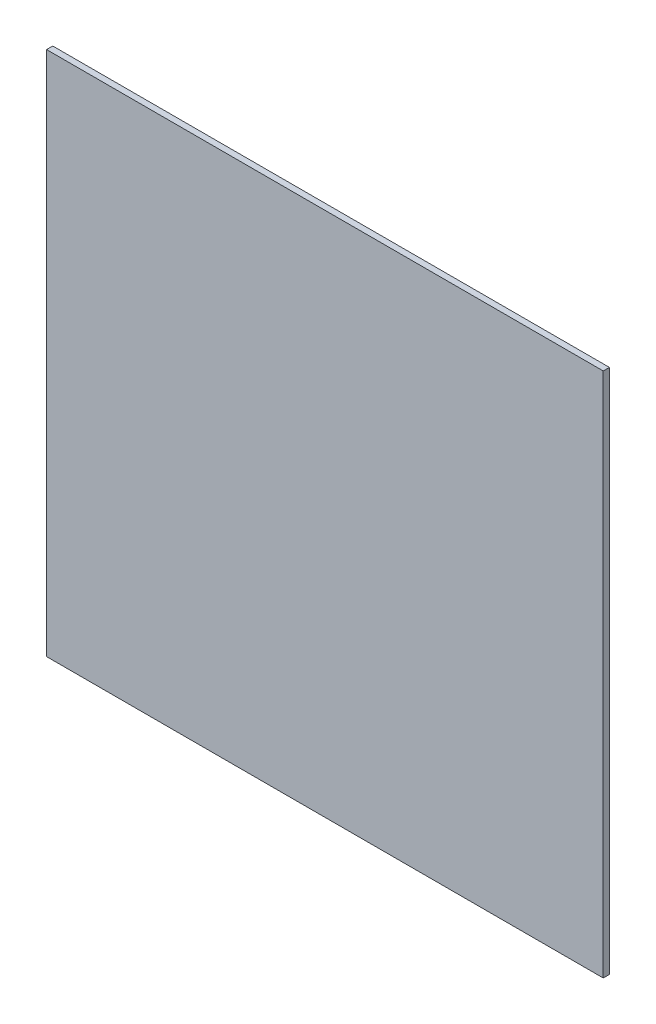
ISO-10303-21;
HEADER;
FILE_DESCRIPTION(('STEP AP214'),'2;1');
FILE_NAME('part.step','',(''),(''),'','','');
FILE_SCHEMA(('AUTOMOTIVE_DESIGN { 1 0 10303 214 1 1 1 1 }'));
ENDSEC;
DATA;
#1=APPLICATION_CONTEXT('core data for automotive mechanical design processes');
#2=APPLICATION_PROTOCOL_DEFINITION('international standard','automotive_design',2000,#1);
#3=PRODUCT_CONTEXT('',#1,'mechanical');
#4=PRODUCT('Part','Part','',(#3));
#5=PRODUCT_RELATED_PRODUCT_CATEGORY('part','',(#4));
#6=PRODUCT_DEFINITION_FORMATION('','',#4);
#7=PRODUCT_DEFINITION_CONTEXT('part definition',#1,'design');
#8=PRODUCT_DEFINITION('design','',#6,#7);
#9=PRODUCT_DEFINITION_SHAPE('','',#8);
#10=(LENGTH_UNIT() NAMED_UNIT(*) SI_UNIT(.MILLI.,.METRE.));
#11=(NAMED_UNIT(*) PLANE_ANGLE_UNIT() SI_UNIT($,.RADIAN.));
#12=(NAMED_UNIT(*) SI_UNIT($,.STERADIAN.) SOLID_ANGLE_UNIT());
#13=UNCERTAINTY_MEASURE_WITH_UNIT(LENGTH_MEASURE(1.E-05),#10,'distance_accuracy_value','');
#14=(GEOMETRIC_REPRESENTATION_CONTEXT(3) GLOBAL_UNCERTAINTY_ASSIGNED_CONTEXT((#13)) GLOBAL_UNIT_ASSIGNED_CONTEXT((#10,
#11,#12)) REPRESENTATION_CONTEXT('',''));
#15=CARTESIAN_POINT('',(0.,0.,0.));
#16=DIRECTION('',(0.,0.,1.));
#17=DIRECTION('',(1.,0.,0.));
#18=AXIS2_PLACEMENT_3D('',#15,#16,#17);
#19=CARTESIAN_POINT('',(-180.,170.,2.));
#20=DIRECTION('',(1.,0.,0.));
#21=DIRECTION('',(0.,1.,0.));
#22=AXIS2_PLACEMENT_3D('',#19,#20,#21);
#23=PLANE('',#22);
#24=DIRECTION('',(0.,-1.,0.));
#25=VECTOR('',#24,1.);
#26=CARTESIAN_POINT('',(-180.,170.,-2.));
#27=LINE('',#26,#25);
#28=CARTESIAN_POINT('',(-180.,170.,-2.));
#29=VERTEX_POINT('',#28);
#30=CARTESIAN_POINT('',(-180.,-170.,-2.));
#31=VERTEX_POINT('',#30);
#32=EDGE_CURVE('E96',#29,#31,#27,.T.);
#33=ORIENTED_EDGE('',*,*,#32,.T.);
#34=DIRECTION('',(0.,0.,-1.));
#35=VECTOR('',#34,1.);
#36=CARTESIAN_POINT('',(-180.,-170.,2.));
#37=LINE('',#36,#35);
#38=CARTESIAN_POINT('',(-180.,-170.,2.));
#39=VERTEX_POINT('',#38);
#40=EDGE_CURVE('E11',#39,#31,#37,.T.);
#41=ORIENTED_EDGE('',*,*,#40,.F.);
#42=DIRECTION('',(0.,-1.,0.));
#43=VECTOR('',#42,1.);
#44=CARTESIAN_POINT('',(-180.,170.,2.));
#45=LINE('',#44,#43);
#46=CARTESIAN_POINT('',(-180.,170.,2.));
#47=VERTEX_POINT('',#46);
#48=EDGE_CURVE('E84',#47,#39,#45,.T.);
#49=ORIENTED_EDGE('',*,*,#48,.F.);
#50=DIRECTION('',(0.,0.,-1.));
#51=VECTOR('',#50,1.);
#52=CARTESIAN_POINT('',(-180.,170.,2.));
#53=LINE('',#52,#51);
#54=EDGE_CURVE('E92',#47,#29,#53,.T.);
#55=ORIENTED_EDGE('',*,*,#54,.T.);
#56=EDGE_LOOP('',(#33,#41,#49,#55));
#57=FACE_BOUND('',#56,.T.);
#58=ADVANCED_FACE('F33',(#57),#23,.F.);
#59=CARTESIAN_POINT('',(-180.,-170.,2.));
#60=DIRECTION('',(0.,1.,0.));
#61=DIRECTION('',(-1.,0.,0.));
#62=AXIS2_PLACEMENT_3D('',#59,#60,#61);
#63=PLANE('',#62);
#64=DIRECTION('',(1.,0.,0.));
#65=VECTOR('',#64,1.);
#66=CARTESIAN_POINT('',(-180.,-170.,-2.));
#67=LINE('',#66,#65);
#68=CARTESIAN_POINT('',(180.,-170.,-2.));
#69=VERTEX_POINT('',#68);
#70=EDGE_CURVE('E88',#31,#69,#67,.T.);
#71=ORIENTED_EDGE('',*,*,#70,.T.);
#72=DIRECTION('',(0.,0.,-1.));
#73=VECTOR('',#72,1.);
#74=CARTESIAN_POINT('',(180.,-170.,2.));
#75=LINE('',#74,#73);
#76=CARTESIAN_POINT('',(180.,-170.,2.));
#77=VERTEX_POINT('',#76);
#78=EDGE_CURVE('E41',#77,#69,#75,.T.);
#79=ORIENTED_EDGE('',*,*,#78,.F.);
#80=DIRECTION('',(1.,0.,0.));
#81=VECTOR('',#80,1.);
#82=CARTESIAN_POINT('',(-180.,-170.,2.));
#83=LINE('',#82,#81);
#84=EDGE_CURVE('E79',#39,#77,#83,.T.);
#85=ORIENTED_EDGE('',*,*,#84,.F.);
#86=ORIENTED_EDGE('',*,*,#40,.T.);
#87=EDGE_LOOP('',(#71,#79,#85,#86));
#88=FACE_BOUND('',#87,.T.);
#89=ADVANCED_FACE('F87',(#88),#63,.F.);
#90=CARTESIAN_POINT('',(180.,170.,2.));
#91=DIRECTION('',(-1.,0.,0.));
#92=DIRECTION('',(0.,-1.,0.));
#93=AXIS2_PLACEMENT_3D('',#90,#91,#92);
#94=PLANE('',#93);
#95=DIRECTION('',(0.,1.,0.));
#96=VECTOR('',#95,1.);
#97=CARTESIAN_POINT('',(180.,170.,-2.));
#98=LINE('',#97,#96);
#99=CARTESIAN_POINT('',(180.,170.,-2.));
#100=VERTEX_POINT('',#99);
#101=EDGE_CURVE('E66',#69,#100,#98,.T.);
#102=ORIENTED_EDGE('',*,*,#101,.T.);
#103=DIRECTION('',(0.,0.,-1.));
#104=VECTOR('',#103,1.);
#105=CARTESIAN_POINT('',(180.,170.,2.));
#106=LINE('',#105,#104);
#107=CARTESIAN_POINT('',(180.,170.,2.));
#108=VERTEX_POINT('',#107);
#109=EDGE_CURVE('E89',#108,#100,#106,.T.);
#110=ORIENTED_EDGE('',*,*,#109,.F.);
#111=DIRECTION('',(0.,1.,0.));
#112=VECTOR('',#111,1.);
#113=CARTESIAN_POINT('',(180.,170.,2.));
#114=LINE('',#113,#112);
#115=EDGE_CURVE('E82',#77,#108,#114,.T.);
#116=ORIENTED_EDGE('',*,*,#115,.F.);
#117=ORIENTED_EDGE('',*,*,#78,.T.);
#118=EDGE_LOOP('',(#102,#110,#116,#117));
#119=FACE_BOUND('',#118,.T.);
#120=ADVANCED_FACE('F90',(#119),#94,.F.);
#121=CARTESIAN_POINT('',(-180.,170.,2.));
#122=DIRECTION('',(0.,-1.,0.));
#123=DIRECTION('',(1.,0.,0.));
#124=AXIS2_PLACEMENT_3D('',#121,#122,#123);
#125=PLANE('',#124);
#126=DIRECTION('',(-1.,0.,0.));
#127=VECTOR('',#126,1.);
#128=CARTESIAN_POINT('',(-180.,170.,-2.));
#129=LINE('',#128,#127);
#130=EDGE_CURVE('E72',#100,#29,#129,.T.);
#131=ORIENTED_EDGE('',*,*,#130,.T.);
#132=ORIENTED_EDGE('',*,*,#54,.F.);
#133=DIRECTION('',(-1.,0.,0.));
#134=VECTOR('',#133,1.);
#135=CARTESIAN_POINT('',(-180.,170.,2.));
#136=LINE('',#135,#134);
#137=EDGE_CURVE('E49',#108,#47,#136,.T.);
#138=ORIENTED_EDGE('',*,*,#137,.F.);
#139=ORIENTED_EDGE('',*,*,#109,.T.);
#140=EDGE_LOOP('',(#131,#132,#138,#139));
#141=FACE_BOUND('',#140,.T.);
#142=ADVANCED_FACE('F103',(#141),#125,.F.);
#143=CARTESIAN_POINT('',(0.,0.,2.));
#144=DIRECTION('',(0.,0.,1.));
#145=DIRECTION('',(1.,0.,0.));
#146=AXIS2_PLACEMENT_3D('',#143,#144,#145);
#147=PLANE('',#146);
#148=ORIENTED_EDGE('',*,*,#48,.T.);
#149=ORIENTED_EDGE('',*,*,#84,.T.);
#150=ORIENTED_EDGE('',*,*,#115,.T.);
#151=ORIENTED_EDGE('',*,*,#137,.T.);
#152=EDGE_LOOP('',(#148,#149,#150,#151));
#153=FACE_BOUND('',#152,.T.);
#154=ADVANCED_FACE('F80',(#153),#147,.T.);
#155=CARTESIAN_POINT('',(0.,0.,-2.));
#156=DIRECTION('',(0.,0.,1.));
#157=DIRECTION('',(1.,0.,0.));
#158=AXIS2_PLACEMENT_3D('',#155,#156,#157);
#159=PLANE('',#158);
#160=ORIENTED_EDGE('',*,*,#32,.F.);
#161=ORIENTED_EDGE('',*,*,#130,.F.);
#162=ORIENTED_EDGE('',*,*,#101,.F.);
#163=ORIENTED_EDGE('',*,*,#70,.F.);
#164=EDGE_LOOP('',(#160,#161,#162,#163));
#165=FACE_BOUND('',#164,.T.);
#166=ADVANCED_FACE('F106',(#165),#159,.F.);
#167=CLOSED_SHELL('',(#58,#89,#120,#142,#154,#166));
#168=MANIFOLD_SOLID_BREP('B2',#167);
#169=ADVANCED_BREP_SHAPE_REPRESENTATION('',(#18,#168),#14);
#170=SHAPE_DEFINITION_REPRESENTATION(#9,#169);
ENDSEC;
END-ISO-10303-21;
